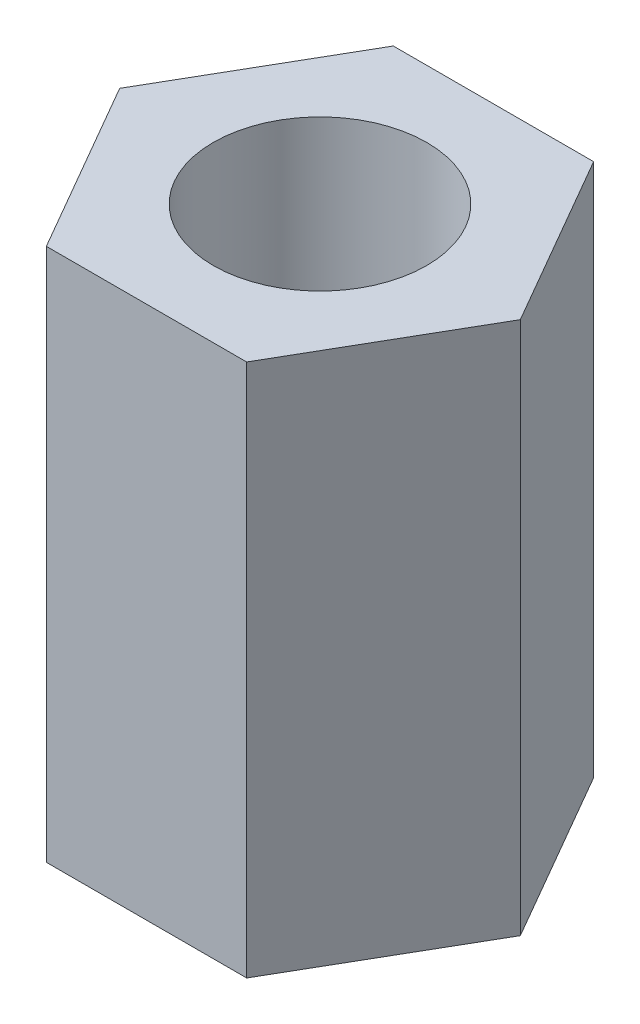
ISO-10303-21;
HEADER;
FILE_DESCRIPTION(('STEP AP214'),'2;1');
FILE_NAME('part.step','',(''),(''),'','','');
FILE_SCHEMA(('AUTOMOTIVE_DESIGN { 1 0 10303 214 1 1 1 1 }'));
ENDSEC;
DATA;
#1=APPLICATION_CONTEXT('core data for automotive mechanical design processes');
#2=APPLICATION_PROTOCOL_DEFINITION('international standard','automotive_design',2000,#1);
#3=PRODUCT_CONTEXT('',#1,'mechanical');
#4=PRODUCT('Part','Part','',(#3));
#5=PRODUCT_RELATED_PRODUCT_CATEGORY('part','',(#4));
#6=PRODUCT_DEFINITION_FORMATION('','',#4);
#7=PRODUCT_DEFINITION_CONTEXT('part definition',#1,'design');
#8=PRODUCT_DEFINITION('design','',#6,#7);
#9=PRODUCT_DEFINITION_SHAPE('','',#8);
#10=(LENGTH_UNIT() NAMED_UNIT(*) SI_UNIT(.MILLI.,.METRE.));
#11=(NAMED_UNIT(*) PLANE_ANGLE_UNIT() SI_UNIT($,.RADIAN.));
#12=(NAMED_UNIT(*) SI_UNIT($,.STERADIAN.) SOLID_ANGLE_UNIT());
#13=UNCERTAINTY_MEASURE_WITH_UNIT(LENGTH_MEASURE(1.E-05),#10,'distance_accuracy_value','');
#14=(GEOMETRIC_REPRESENTATION_CONTEXT(3) GLOBAL_UNCERTAINTY_ASSIGNED_CONTEXT((#13)) GLOBAL_UNIT_ASSIGNED_CONTEXT((#10,
#11,#12)) REPRESENTATION_CONTEXT('',''));
#15=CARTESIAN_POINT('',(0.,0.,0.));
#16=DIRECTION('',(0.,0.,1.));
#17=DIRECTION('',(1.,0.,0.));
#18=AXIS2_PLACEMENT_3D('',#15,#16,#17);
#19=CARTESIAN_POINT('',(0.,10.,0.));
#20=DIRECTION('',(0.,1.,0.));
#21=DIRECTION('',(0.,0.,1.));
#22=AXIS2_PLACEMENT_3D('',#19,#20,#21);
#23=PLANE('',#22);
#24=DIRECTION('',(-0.499999999999999,0.,-0.866025403784439));
#25=VECTOR('',#24,1.);
#26=CARTESIAN_POINT('',(7.51,10.,0.));
#27=LINE('',#26,#25);
#28=CARTESIAN_POINT('',(7.51,10.,0.));
#29=VERTEX_POINT('',#28);
#30=CARTESIAN_POINT('',(3.755,10.,-6.50385078242113));
#31=VERTEX_POINT('',#30);
#32=EDGE_CURVE('E135',#29,#31,#27,.T.);
#33=ORIENTED_EDGE('',*,*,#32,.T.);
#34=DIRECTION('',(-1.,0.,0.));
#35=VECTOR('',#34,1.);
#36=CARTESIAN_POINT('',(3.755,10.,-6.50385078242113));
#37=LINE('',#36,#35);
#38=CARTESIAN_POINT('',(-3.755,10.,-6.50385078242113));
#39=VERTEX_POINT('',#38);
#40=EDGE_CURVE('E93',#31,#39,#37,.T.);
#41=ORIENTED_EDGE('',*,*,#40,.T.);
#42=DIRECTION('',(-0.5,0.,0.866025403784439));
#43=VECTOR('',#42,1.);
#44=CARTESIAN_POINT('',(-3.755,10.,-6.50385078242113));
#45=LINE('',#44,#43);
#46=CARTESIAN_POINT('',(-7.51,10.,0.));
#47=VERTEX_POINT('',#46);
#48=EDGE_CURVE('E106',#39,#47,#45,.T.);
#49=ORIENTED_EDGE('',*,*,#48,.T.);
#50=DIRECTION('',(0.5,0.,0.866025403784439));
#51=VECTOR('',#50,1.);
#52=CARTESIAN_POINT('',(-7.51,10.,0.));
#53=LINE('',#52,#51);
#54=CARTESIAN_POINT('',(-3.755,10.,6.50385078242113));
#55=VERTEX_POINT('',#54);
#56=EDGE_CURVE('E100',#47,#55,#53,.T.);
#57=ORIENTED_EDGE('',*,*,#56,.T.);
#58=DIRECTION('',(1.,0.,0.));
#59=VECTOR('',#58,1.);
#60=CARTESIAN_POINT('',(-3.755,10.,6.50385078242113));
#61=LINE('',#60,#59);
#62=CARTESIAN_POINT('',(3.755,10.,6.50385078242113));
#63=VERTEX_POINT('',#62);
#64=EDGE_CURVE('E104',#55,#63,#61,.T.);
#65=ORIENTED_EDGE('',*,*,#64,.T.);
#66=DIRECTION('',(0.5,0.,-0.866025403784439));
#67=VECTOR('',#66,1.);
#68=CARTESIAN_POINT('',(3.755,10.,6.50385078242113));
#69=LINE('',#68,#67);
#70=EDGE_CURVE('E56',#63,#29,#69,.T.);
#71=ORIENTED_EDGE('',*,*,#70,.T.);
#72=EDGE_LOOP('',(#33,#41,#49,#57,#65,#71));
#73=FACE_BOUND('',#72,.T.);
#74=CARTESIAN_POINT('',(0.,10.,0.));
#75=DIRECTION('',(0.,1.,0.));
#76=DIRECTION('',(0.,0.,1.));
#77=AXIS2_PLACEMENT_3D('',#74,#75,#76);
#78=CIRCLE('',#77,4.);
#79=CARTESIAN_POINT('',(0.,10.,4.));
#80=VERTEX_POINT('',#79);
#81=EDGE_CURVE('E128',#80,#80,#78,.T.);
#82=ORIENTED_EDGE('',*,*,#81,.F.);
#83=EDGE_LOOP('',(#82));
#84=FACE_BOUND('',#83,.T.);
#85=ADVANCED_FACE('F39',(#73,#84),#23,.T.);
#86=CARTESIAN_POINT('',(0.,-10.,0.));
#87=DIRECTION('',(0.,1.,0.));
#88=DIRECTION('',(0.,0.,1.));
#89=AXIS2_PLACEMENT_3D('',#86,#87,#88);
#90=PLANE('',#89);
#91=DIRECTION('',(-0.499999999999999,0.,-0.866025403784439));
#92=VECTOR('',#91,1.);
#93=CARTESIAN_POINT('',(7.51,-10.,0.));
#94=LINE('',#93,#92);
#95=CARTESIAN_POINT('',(7.51,-10.,0.));
#96=VERTEX_POINT('',#95);
#97=CARTESIAN_POINT('',(3.755,-10.,-6.50385078242113));
#98=VERTEX_POINT('',#97);
#99=EDGE_CURVE('E124',#96,#98,#94,.T.);
#100=ORIENTED_EDGE('',*,*,#99,.F.);
#101=DIRECTION('',(0.5,0.,-0.866025403784439));
#102=VECTOR('',#101,1.);
#103=CARTESIAN_POINT('',(3.755,-10.,6.50385078242113));
#104=LINE('',#103,#102);
#105=CARTESIAN_POINT('',(3.755,-10.,6.50385078242113));
#106=VERTEX_POINT('',#105);
#107=EDGE_CURVE('E85',#106,#96,#104,.T.);
#108=ORIENTED_EDGE('',*,*,#107,.F.);
#109=DIRECTION('',(1.,0.,0.));
#110=VECTOR('',#109,1.);
#111=CARTESIAN_POINT('',(-3.755,-10.,6.50385078242113));
#112=LINE('',#111,#110);
#113=CARTESIAN_POINT('',(-3.755,-10.,6.50385078242113));
#114=VERTEX_POINT('',#113);
#115=EDGE_CURVE('E79',#114,#106,#112,.T.);
#116=ORIENTED_EDGE('',*,*,#115,.F.);
#117=DIRECTION('',(0.5,0.,0.866025403784439));
#118=VECTOR('',#117,1.);
#119=CARTESIAN_POINT('',(-7.51,-10.,0.));
#120=LINE('',#119,#118);
#121=CARTESIAN_POINT('',(-7.51,-10.,0.));
#122=VERTEX_POINT('',#121);
#123=EDGE_CURVE('E114',#122,#114,#120,.T.);
#124=ORIENTED_EDGE('',*,*,#123,.F.);
#125=DIRECTION('',(-0.5,0.,0.866025403784439));
#126=VECTOR('',#125,1.);
#127=CARTESIAN_POINT('',(-3.755,-10.,-6.50385078242113));
#128=LINE('',#127,#126);
#129=CARTESIAN_POINT('',(-3.755,-10.,-6.50385078242113));
#130=VERTEX_POINT('',#129);
#131=EDGE_CURVE('E130',#130,#122,#128,.T.);
#132=ORIENTED_EDGE('',*,*,#131,.F.);
#133=DIRECTION('',(-1.,0.,0.));
#134=VECTOR('',#133,1.);
#135=CARTESIAN_POINT('',(3.755,-10.,-6.50385078242113));
#136=LINE('',#135,#134);
#137=EDGE_CURVE('E127',#98,#130,#136,.T.);
#138=ORIENTED_EDGE('',*,*,#137,.F.);
#139=EDGE_LOOP('',(#100,#108,#116,#124,#132,#138));
#140=FACE_BOUND('',#139,.T.);
#141=CARTESIAN_POINT('',(0.,-10.,0.));
#142=DIRECTION('',(0.,1.,0.));
#143=DIRECTION('',(0.,0.,1.));
#144=AXIS2_PLACEMENT_3D('',#141,#142,#143);
#145=CIRCLE('',#144,4.);
#146=CARTESIAN_POINT('',(0.,-10.,4.));
#147=VERTEX_POINT('',#146);
#148=EDGE_CURVE('E228',#147,#147,#145,.T.);
#149=ORIENTED_EDGE('',*,*,#148,.T.);
#150=EDGE_LOOP('',(#149));
#151=FACE_BOUND('',#150,.T.);
#152=ADVANCED_FACE('F144',(#140,#151),#90,.F.);
#153=CARTESIAN_POINT('',(7.51,10.,0.));
#154=DIRECTION('',(-0.866025403784439,0.,0.5));
#155=DIRECTION('',(0.5,0.,0.866025403784439));
#156=AXIS2_PLACEMENT_3D('',#153,#154,#155);
#157=PLANE('',#156);
#158=ORIENTED_EDGE('',*,*,#99,.T.);
#159=DIRECTION('',(0.,-1.,0.));
#160=VECTOR('',#159,1.);
#161=CARTESIAN_POINT('',(3.755,10.,-6.50385078242113));
#162=LINE('',#161,#160);
#163=EDGE_CURVE('E11',#31,#98,#162,.T.);
#164=ORIENTED_EDGE('',*,*,#163,.F.);
#165=ORIENTED_EDGE('',*,*,#32,.F.);
#166=DIRECTION('',(0.,-1.,0.));
#167=VECTOR('',#166,1.);
#168=CARTESIAN_POINT('',(7.51,10.,0.));
#169=LINE('',#168,#167);
#170=EDGE_CURVE('E120',#29,#96,#169,.T.);
#171=ORIENTED_EDGE('',*,*,#170,.T.);
#172=EDGE_LOOP('',(#158,#164,#165,#171));
#173=FACE_BOUND('',#172,.T.);
#174=ADVANCED_FACE('F41',(#173),#157,.F.);
#175=CARTESIAN_POINT('',(3.755,10.,-6.50385078242113));
#176=DIRECTION('',(0.,0.,1.));
#177=DIRECTION('',(1.,0.,0.));
#178=AXIS2_PLACEMENT_3D('',#175,#176,#177);
#179=PLANE('',#178);
#180=ORIENTED_EDGE('',*,*,#137,.T.);
#181=DIRECTION('',(0.,-1.,0.));
#182=VECTOR('',#181,1.);
#183=CARTESIAN_POINT('',(-3.755,10.,-6.50385078242113));
#184=LINE('',#183,#182);
#185=EDGE_CURVE('E48',#39,#130,#184,.T.);
#186=ORIENTED_EDGE('',*,*,#185,.F.);
#187=ORIENTED_EDGE('',*,*,#40,.F.);
#188=ORIENTED_EDGE('',*,*,#163,.T.);
#189=EDGE_LOOP('',(#180,#186,#187,#188));
#190=FACE_BOUND('',#189,.T.);
#191=ADVANCED_FACE('F169',(#190),#179,.F.);
#192=CARTESIAN_POINT('',(-3.755,10.,-6.50385078242113));
#193=DIRECTION('',(0.866025403784439,0.,0.5));
#194=DIRECTION('',(0.5,0.,-0.866025403784439));
#195=AXIS2_PLACEMENT_3D('',#192,#193,#194);
#196=PLANE('',#195);
#197=ORIENTED_EDGE('',*,*,#131,.T.);
#198=DIRECTION('',(0.,-1.,0.));
#199=VECTOR('',#198,1.);
#200=CARTESIAN_POINT('',(-7.51,10.,0.));
#201=LINE('',#200,#199);
#202=EDGE_CURVE('E115',#47,#122,#201,.T.);
#203=ORIENTED_EDGE('',*,*,#202,.F.);
#204=ORIENTED_EDGE('',*,*,#48,.F.);
#205=ORIENTED_EDGE('',*,*,#185,.T.);
#206=EDGE_LOOP('',(#197,#203,#204,#205));
#207=FACE_BOUND('',#206,.T.);
#208=ADVANCED_FACE('F141',(#207),#196,.F.);
#209=CARTESIAN_POINT('',(-7.51,10.,0.));
#210=DIRECTION('',(0.866025403784439,0.,-0.5));
#211=DIRECTION('',(-0.5,0.,-0.866025403784439));
#212=AXIS2_PLACEMENT_3D('',#209,#210,#211);
#213=PLANE('',#212);
#214=ORIENTED_EDGE('',*,*,#123,.T.);
#215=DIRECTION('',(0.,-1.,0.));
#216=VECTOR('',#215,1.);
#217=CARTESIAN_POINT('',(-3.755,10.,6.50385078242113));
#218=LINE('',#217,#216);
#219=EDGE_CURVE('E111',#55,#114,#218,.T.);
#220=ORIENTED_EDGE('',*,*,#219,.F.);
#221=ORIENTED_EDGE('',*,*,#56,.F.);
#222=ORIENTED_EDGE('',*,*,#202,.T.);
#223=EDGE_LOOP('',(#214,#220,#221,#222));
#224=FACE_BOUND('',#223,.T.);
#225=ADVANCED_FACE('F112',(#224),#213,.F.);
#226=CARTESIAN_POINT('',(-3.755,10.,6.50385078242113));
#227=DIRECTION('',(0.,0.,-1.));
#228=DIRECTION('',(-1.,0.,0.));
#229=AXIS2_PLACEMENT_3D('',#226,#227,#228);
#230=PLANE('',#229);
#231=ORIENTED_EDGE('',*,*,#115,.T.);
#232=DIRECTION('',(0.,-1.,0.));
#233=VECTOR('',#232,1.);
#234=CARTESIAN_POINT('',(3.755,10.,6.50385078242113));
#235=LINE('',#234,#233);
#236=EDGE_CURVE('E116',#63,#106,#235,.T.);
#237=ORIENTED_EDGE('',*,*,#236,.F.);
#238=ORIENTED_EDGE('',*,*,#64,.F.);
#239=ORIENTED_EDGE('',*,*,#219,.T.);
#240=EDGE_LOOP('',(#231,#237,#238,#239));
#241=FACE_BOUND('',#240,.T.);
#242=ADVANCED_FACE('F118',(#241),#230,.F.);
#243=CARTESIAN_POINT('',(3.755,10.,6.50385078242113));
#244=DIRECTION('',(-0.866025403784439,0.,-0.5));
#245=DIRECTION('',(-0.5,0.,0.866025403784439));
#246=AXIS2_PLACEMENT_3D('',#243,#244,#245);
#247=PLANE('',#246);
#248=ORIENTED_EDGE('',*,*,#107,.T.);
#249=ORIENTED_EDGE('',*,*,#170,.F.);
#250=ORIENTED_EDGE('',*,*,#70,.F.);
#251=ORIENTED_EDGE('',*,*,#236,.T.);
#252=EDGE_LOOP('',(#248,#249,#250,#251));
#253=FACE_BOUND('',#252,.T.);
#254=ADVANCED_FACE('F149',(#253),#247,.F.);
#255=CARTESIAN_POINT('',(0.,10.,0.));
#256=DIRECTION('',(0.,-1.,0.));
#257=DIRECTION('',(0.,0.,-1.));
#258=AXIS2_PLACEMENT_3D('',#255,#256,#257);
#259=CYLINDRICAL_SURFACE('',#258,4.);
#260=ORIENTED_EDGE('',*,*,#81,.T.);
#261=EDGE_LOOP('',(#260));
#262=FACE_BOUND('',#261,.T.);
#263=ORIENTED_EDGE('',*,*,#148,.F.);
#264=EDGE_LOOP('',(#263));
#265=FACE_BOUND('',#264,.T.);
#266=ADVANCED_FACE('F151',(#262,#265),#259,.F.);
#267=CLOSED_SHELL('',(#85,#152,#174,#191,#208,#225,#242,#254,#266));
#268=MANIFOLD_SOLID_BREP('B2',#267);
#269=ADVANCED_BREP_SHAPE_REPRESENTATION('',(#18,#268),#14);
#270=SHAPE_DEFINITION_REPRESENTATION(#9,#269);
ENDSEC;
END-ISO-10303-21;
